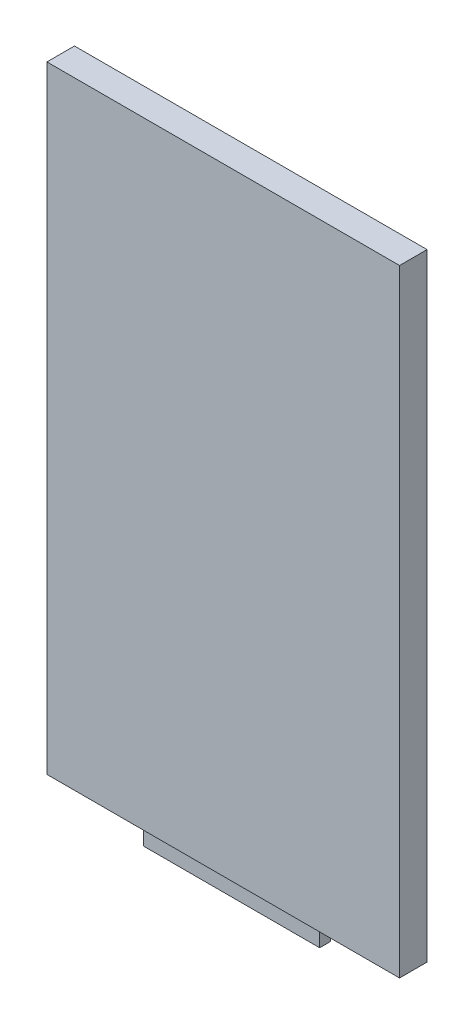
ISO-10303-21;
HEADER;
FILE_DESCRIPTION(('STEP AP214'),'2;1');
FILE_NAME('part.step','',(''),(''),'','','');
FILE_SCHEMA(('AUTOMOTIVE_DESIGN { 1 0 10303 214 1 1 1 1 }'));
ENDSEC;
DATA;
#1=APPLICATION_CONTEXT('core data for automotive mechanical design processes');
#2=APPLICATION_PROTOCOL_DEFINITION('international standard','automotive_design',2000,#1);
#3=PRODUCT_CONTEXT('',#1,'mechanical');
#4=PRODUCT('Part','Part','',(#3));
#5=PRODUCT_RELATED_PRODUCT_CATEGORY('part','',(#4));
#6=PRODUCT_DEFINITION_FORMATION('','',#4);
#7=PRODUCT_DEFINITION_CONTEXT('part definition',#1,'design');
#8=PRODUCT_DEFINITION('design','',#6,#7);
#9=PRODUCT_DEFINITION_SHAPE('','',#8);
#10=(LENGTH_UNIT() NAMED_UNIT(*) SI_UNIT(.MILLI.,.METRE.));
#11=(NAMED_UNIT(*) PLANE_ANGLE_UNIT() SI_UNIT($,.RADIAN.));
#12=(NAMED_UNIT(*) SI_UNIT($,.STERADIAN.) SOLID_ANGLE_UNIT());
#13=UNCERTAINTY_MEASURE_WITH_UNIT(LENGTH_MEASURE(1.E-05),#10,'distance_accuracy_value','');
#14=(GEOMETRIC_REPRESENTATION_CONTEXT(3) GLOBAL_UNCERTAINTY_ASSIGNED_CONTEXT((#13)) GLOBAL_UNIT_ASSIGNED_CONTEXT((#10,
#11,#12)) REPRESENTATION_CONTEXT('',''));
#15=CARTESIAN_POINT('',(0.,0.,0.));
#16=DIRECTION('',(0.,0.,1.));
#17=DIRECTION('',(1.,0.,0.));
#18=AXIS2_PLACEMENT_3D('',#15,#16,#17);
#19=CARTESIAN_POINT('',(0.,0.,0.));
#20=DIRECTION('',(0.,1.,0.));
#21=DIRECTION('',(0.,0.,1.));
#22=AXIS2_PLACEMENT_3D('',#19,#20,#21);
#23=PLANE('',#22);
#24=DIRECTION('',(0.,0.,1.));
#25=VECTOR('',#24,1.);
#26=CARTESIAN_POINT('',(-15.9999999999999,0.,1.25));
#27=LINE('',#26,#25);
#28=CARTESIAN_POINT('',(-15.9999999999999,0.,-1.25));
#29=VERTEX_POINT('',#28);
#30=CARTESIAN_POINT('',(-15.9999999999999,0.,1.25));
#31=VERTEX_POINT('',#30);
#32=EDGE_CURVE('E128',#29,#31,#27,.T.);
#33=ORIENTED_EDGE('',*,*,#32,.F.);
#34=DIRECTION('',(-1.,0.,0.));
#35=VECTOR('',#34,1.);
#36=CARTESIAN_POINT('',(16.0000000000001,0.,-1.25));
#37=LINE('',#36,#35);
#38=CARTESIAN_POINT('',(16.0000000000001,0.,-1.25));
#39=VERTEX_POINT('',#38);
#40=EDGE_CURVE('E144',#39,#29,#37,.T.);
#41=ORIENTED_EDGE('',*,*,#40,.F.);
#42=DIRECTION('',(0.,0.,-1.));
#43=VECTOR('',#42,1.);
#44=CARTESIAN_POINT('',(16.0000000000001,0.,1.25));
#45=LINE('',#44,#43);
#46=CARTESIAN_POINT('',(16.0000000000001,0.,1.25));
#47=VERTEX_POINT('',#46);
#48=EDGE_CURVE('E156',#47,#39,#45,.T.);
#49=ORIENTED_EDGE('',*,*,#48,.F.);
#50=DIRECTION('',(1.,0.,0.));
#51=VECTOR('',#50,1.);
#52=CARTESIAN_POINT('',(16.0000000000001,0.,1.25));
#53=LINE('',#52,#51);
#54=EDGE_CURVE('E133',#31,#47,#53,.T.);
#55=ORIENTED_EDGE('',*,*,#54,.F.);
#56=EDGE_LOOP('',(#33,#41,#49,#55));
#57=FACE_BOUND('',#56,.T.);
#58=DIRECTION('',(0.,0.,1.));
#59=VECTOR('',#58,1.);
#60=CARTESIAN_POINT('',(8.,0.,0.5));
#61=LINE('',#60,#59);
#62=CARTESIAN_POINT('',(8.,0.,-0.5));
#63=VERTEX_POINT('',#62);
#64=CARTESIAN_POINT('',(8.,0.,0.5));
#65=VERTEX_POINT('',#64);
#66=EDGE_CURVE('E55',#63,#65,#61,.T.);
#67=ORIENTED_EDGE('',*,*,#66,.F.);
#68=DIRECTION('',(1.,0.,0.));
#69=VECTOR('',#68,1.);
#70=CARTESIAN_POINT('',(-8.,0.,-0.5));
#71=LINE('',#70,#69);
#72=CARTESIAN_POINT('',(-8.,0.,-0.5));
#73=VERTEX_POINT('',#72);
#74=EDGE_CURVE('E59',#73,#63,#71,.T.);
#75=ORIENTED_EDGE('',*,*,#74,.F.);
#76=DIRECTION('',(0.,0.,-1.));
#77=VECTOR('',#76,1.);
#78=CARTESIAN_POINT('',(-8.,0.,0.5));
#79=LINE('',#78,#77);
#80=CARTESIAN_POINT('',(-8.,0.,0.5));
#81=VERTEX_POINT('',#80);
#82=EDGE_CURVE('E283',#81,#73,#79,.T.);
#83=ORIENTED_EDGE('',*,*,#82,.F.);
#84=DIRECTION('',(-1.,0.,0.));
#85=VECTOR('',#84,1.);
#86=CARTESIAN_POINT('',(-8.,0.,0.5));
#87=LINE('',#86,#85);
#88=EDGE_CURVE('E293',#65,#81,#87,.T.);
#89=ORIENTED_EDGE('',*,*,#88,.F.);
#90=EDGE_LOOP('',(#67,#75,#83,#89));
#91=FACE_BOUND('',#90,.T.);
#92=ADVANCED_FACE('F39',(#57,#91),#23,.F.);
#93=CARTESIAN_POINT('',(-15.9999999999999,56.,1.25));
#94=DIRECTION('',(1.,0.,0.));
#95=DIRECTION('',(0.,0.,-1.));
#96=AXIS2_PLACEMENT_3D('',#93,#94,#95);
#97=PLANE('',#96);
#98=ORIENTED_EDGE('',*,*,#32,.T.);
#99=DIRECTION('',(0.,-1.,0.));
#100=VECTOR('',#99,1.);
#101=CARTESIAN_POINT('',(-15.9999999999999,56.,1.25));
#102=LINE('',#101,#100);
#103=CARTESIAN_POINT('',(-15.9999999999999,56.,1.25));
#104=VERTEX_POINT('',#103);
#105=EDGE_CURVE('E11',#104,#31,#102,.T.);
#106=ORIENTED_EDGE('',*,*,#105,.F.);
#107=DIRECTION('',(0.,0.,1.));
#108=VECTOR('',#107,1.);
#109=CARTESIAN_POINT('',(-15.9999999999999,56.,1.25));
#110=LINE('',#109,#108);
#111=CARTESIAN_POINT('',(-15.9999999999999,56.,-1.25));
#112=VERTEX_POINT('',#111);
#113=EDGE_CURVE('E139',#112,#104,#110,.T.);
#114=ORIENTED_EDGE('',*,*,#113,.F.);
#115=DIRECTION('',(0.,-1.,0.));
#116=VECTOR('',#115,1.);
#117=CARTESIAN_POINT('',(-15.9999999999999,56.,-1.25));
#118=LINE('',#117,#116);
#119=EDGE_CURVE('E152',#112,#29,#118,.T.);
#120=ORIENTED_EDGE('',*,*,#119,.T.);
#121=EDGE_LOOP('',(#98,#106,#114,#120));
#122=FACE_BOUND('',#121,.T.);
#123=ADVANCED_FACE('F41',(#122),#97,.F.);
#124=CARTESIAN_POINT('',(16.0000000000001,56.,1.25));
#125=DIRECTION('',(0.,0.,-1.));
#126=DIRECTION('',(-1.,0.,0.));
#127=AXIS2_PLACEMENT_3D('',#124,#125,#126);
#128=PLANE('',#127);
#129=ORIENTED_EDGE('',*,*,#54,.T.);
#130=DIRECTION('',(0.,-1.,0.));
#131=VECTOR('',#130,1.);
#132=CARTESIAN_POINT('',(16.0000000000001,56.,1.25));
#133=LINE('',#132,#131);
#134=CARTESIAN_POINT('',(16.0000000000001,56.,1.25));
#135=VERTEX_POINT('',#134);
#136=EDGE_CURVE('E48',#135,#47,#133,.T.);
#137=ORIENTED_EDGE('',*,*,#136,.F.);
#138=DIRECTION('',(1.,0.,0.));
#139=VECTOR('',#138,1.);
#140=CARTESIAN_POINT('',(16.0000000000001,56.,1.25));
#141=LINE('',#140,#139);
#142=EDGE_CURVE('E143',#104,#135,#141,.T.);
#143=ORIENTED_EDGE('',*,*,#142,.F.);
#144=ORIENTED_EDGE('',*,*,#105,.T.);
#145=EDGE_LOOP('',(#129,#137,#143,#144));
#146=FACE_BOUND('',#145,.T.);
#147=ADVANCED_FACE('F188',(#146),#128,.F.);
#148=CARTESIAN_POINT('',(16.0000000000001,56.,1.25));
#149=DIRECTION('',(-1.,0.,0.));
#150=DIRECTION('',(0.,0.,1.));
#151=AXIS2_PLACEMENT_3D('',#148,#149,#150);
#152=PLANE('',#151);
#153=ORIENTED_EDGE('',*,*,#48,.T.);
#154=DIRECTION('',(0.,-1.,0.));
#155=VECTOR('',#154,1.);
#156=CARTESIAN_POINT('',(16.0000000000001,56.,-1.25));
#157=LINE('',#156,#155);
#158=CARTESIAN_POINT('',(16.0000000000001,56.,-1.25));
#159=VERTEX_POINT('',#158);
#160=EDGE_CURVE('E164',#159,#39,#157,.T.);
#161=ORIENTED_EDGE('',*,*,#160,.F.);
#162=DIRECTION('',(0.,0.,-1.));
#163=VECTOR('',#162,1.);
#164=CARTESIAN_POINT('',(16.0000000000001,56.,1.25));
#165=LINE('',#164,#163);
#166=EDGE_CURVE('E147',#135,#159,#165,.T.);
#167=ORIENTED_EDGE('',*,*,#166,.F.);
#168=ORIENTED_EDGE('',*,*,#136,.T.);
#169=EDGE_LOOP('',(#153,#161,#167,#168));
#170=FACE_BOUND('',#169,.T.);
#171=ADVANCED_FACE('F173',(#170),#152,.F.);
#172=CARTESIAN_POINT('',(16.0000000000001,56.,-1.25));
#173=DIRECTION('',(0.,0.,1.));
#174=DIRECTION('',(1.,0.,0.));
#175=AXIS2_PLACEMENT_3D('',#172,#173,#174);
#176=PLANE('',#175);
#177=ORIENTED_EDGE('',*,*,#40,.T.);
#178=ORIENTED_EDGE('',*,*,#119,.F.);
#179=DIRECTION('',(-1.,0.,0.));
#180=VECTOR('',#179,1.);
#181=CARTESIAN_POINT('',(16.0000000000001,56.,-1.25));
#182=LINE('',#181,#180);
#183=EDGE_CURVE('E150',#159,#112,#182,.T.);
#184=ORIENTED_EDGE('',*,*,#183,.F.);
#185=ORIENTED_EDGE('',*,*,#160,.T.);
#186=EDGE_LOOP('',(#177,#178,#184,#185));
#187=FACE_BOUND('',#186,.T.);
#188=ADVANCED_FACE('F181',(#187),#176,.F.);
#189=CARTESIAN_POINT('',(0.,56.,0.));
#190=DIRECTION('',(0.,1.,0.));
#191=DIRECTION('',(0.,0.,1.));
#192=AXIS2_PLACEMENT_3D('',#189,#190,#191);
#193=PLANE('',#192);
#194=ORIENTED_EDGE('',*,*,#113,.T.);
#195=ORIENTED_EDGE('',*,*,#142,.T.);
#196=ORIENTED_EDGE('',*,*,#166,.T.);
#197=ORIENTED_EDGE('',*,*,#183,.T.);
#198=EDGE_LOOP('',(#194,#195,#196,#197));
#199=FACE_BOUND('',#198,.T.);
#200=ADVANCED_FACE('F187',(#199),#193,.T.);
#201=CARTESIAN_POINT('',(8.,-2.,0.5));
#202=DIRECTION('',(-1.,0.,0.));
#203=DIRECTION('',(0.,0.,1.));
#204=AXIS2_PLACEMENT_3D('',#201,#202,#203);
#205=PLANE('',#204);
#206=ORIENTED_EDGE('',*,*,#66,.T.);
#207=DIRECTION('',(0.,1.,0.));
#208=VECTOR('',#207,1.);
#209=CARTESIAN_POINT('',(8.,-2.,0.5));
#210=LINE('',#209,#208);
#211=CARTESIAN_POINT('',(8.,-2.,0.5));
#212=VERTEX_POINT('',#211);
#213=EDGE_CURVE('E108',#212,#65,#210,.T.);
#214=ORIENTED_EDGE('',*,*,#213,.F.);
#215=DIRECTION('',(0.,0.,1.));
#216=VECTOR('',#215,1.);
#217=CARTESIAN_POINT('',(8.,-2.,0.5));
#218=LINE('',#217,#216);
#219=CARTESIAN_POINT('',(8.,-2.,-0.5));
#220=VERTEX_POINT('',#219);
#221=EDGE_CURVE('E115',#220,#212,#218,.T.);
#222=ORIENTED_EDGE('',*,*,#221,.F.);
#223=DIRECTION('',(0.,1.,0.));
#224=VECTOR('',#223,1.);
#225=CARTESIAN_POINT('',(8.,-2.,-0.5));
#226=LINE('',#225,#224);
#227=EDGE_CURVE('E280',#220,#63,#226,.T.);
#228=ORIENTED_EDGE('',*,*,#227,.T.);
#229=EDGE_LOOP('',(#206,#214,#222,#228));
#230=FACE_BOUND('',#229,.T.);
#231=ADVANCED_FACE('F126',(#230),#205,.F.);
#232=CARTESIAN_POINT('',(-8.,-2.,0.5));
#233=DIRECTION('',(0.,0.,-1.));
#234=DIRECTION('',(-1.,0.,0.));
#235=AXIS2_PLACEMENT_3D('',#232,#233,#234);
#236=PLANE('',#235);
#237=ORIENTED_EDGE('',*,*,#88,.T.);
#238=DIRECTION('',(0.,1.,0.));
#239=VECTOR('',#238,1.);
#240=CARTESIAN_POINT('',(-8.,-2.,0.5));
#241=LINE('',#240,#239);
#242=CARTESIAN_POINT('',(-8.,-2.,0.5));
#243=VERTEX_POINT('',#242);
#244=EDGE_CURVE('E110',#243,#81,#241,.T.);
#245=ORIENTED_EDGE('',*,*,#244,.F.);
#246=DIRECTION('',(-1.,0.,0.));
#247=VECTOR('',#246,1.);
#248=CARTESIAN_POINT('',(-8.,-2.,0.5));
#249=LINE('',#248,#247);
#250=EDGE_CURVE('E103',#212,#243,#249,.T.);
#251=ORIENTED_EDGE('',*,*,#250,.F.);
#252=ORIENTED_EDGE('',*,*,#213,.T.);
#253=EDGE_LOOP('',(#237,#245,#251,#252));
#254=FACE_BOUND('',#253,.T.);
#255=ADVANCED_FACE('F106',(#254),#236,.F.);
#256=CARTESIAN_POINT('',(-8.,-2.,0.5));
#257=DIRECTION('',(1.,0.,0.));
#258=DIRECTION('',(0.,0.,-1.));
#259=AXIS2_PLACEMENT_3D('',#256,#257,#258);
#260=PLANE('',#259);
#261=ORIENTED_EDGE('',*,*,#82,.T.);
#262=DIRECTION('',(0.,1.,0.));
#263=VECTOR('',#262,1.);
#264=CARTESIAN_POINT('',(-8.,-2.,-0.5));
#265=LINE('',#264,#263);
#266=CARTESIAN_POINT('',(-8.,-2.,-0.5));
#267=VERTEX_POINT('',#266);
#268=EDGE_CURVE('E135',#267,#73,#265,.T.);
#269=ORIENTED_EDGE('',*,*,#268,.F.);
#270=DIRECTION('',(0.,0.,-1.));
#271=VECTOR('',#270,1.);
#272=CARTESIAN_POINT('',(-8.,-2.,0.5));
#273=LINE('',#272,#271);
#274=EDGE_CURVE('E114',#243,#267,#273,.T.);
#275=ORIENTED_EDGE('',*,*,#274,.F.);
#276=ORIENTED_EDGE('',*,*,#244,.T.);
#277=EDGE_LOOP('',(#261,#269,#275,#276));
#278=FACE_BOUND('',#277,.T.);
#279=ADVANCED_FACE('F212',(#278),#260,.F.);
#280=CARTESIAN_POINT('',(-8.,-2.,-0.5));
#281=DIRECTION('',(0.,0.,1.));
#282=DIRECTION('',(1.,0.,0.));
#283=AXIS2_PLACEMENT_3D('',#280,#281,#282);
#284=PLANE('',#283);
#285=ORIENTED_EDGE('',*,*,#74,.T.);
#286=ORIENTED_EDGE('',*,*,#227,.F.);
#287=DIRECTION('',(1.,0.,0.));
#288=VECTOR('',#287,1.);
#289=CARTESIAN_POINT('',(-8.,-2.,-0.5));
#290=LINE('',#289,#288);
#291=EDGE_CURVE('E120',#267,#220,#290,.T.);
#292=ORIENTED_EDGE('',*,*,#291,.F.);
#293=ORIENTED_EDGE('',*,*,#268,.T.);
#294=EDGE_LOOP('',(#285,#286,#292,#293));
#295=FACE_BOUND('',#294,.T.);
#296=ADVANCED_FACE('F217',(#295),#284,.F.);
#297=CARTESIAN_POINT('',(0.,-2.,0.));
#298=DIRECTION('',(0.,-1.,0.));
#299=DIRECTION('',(0.,0.,-1.));
#300=AXIS2_PLACEMENT_3D('',#297,#298,#299);
#301=PLANE('',#300);
#302=ORIENTED_EDGE('',*,*,#221,.T.);
#303=ORIENTED_EDGE('',*,*,#250,.T.);
#304=ORIENTED_EDGE('',*,*,#274,.T.);
#305=ORIENTED_EDGE('',*,*,#291,.T.);
#306=EDGE_LOOP('',(#302,#303,#304,#305));
#307=FACE_BOUND('',#306,.T.);
#308=ADVANCED_FACE('F118',(#307),#301,.T.);
#309=CLOSED_SHELL('',(#92,#123,#147,#171,#188,#200,#231,#255,#279,#296,#308));
#310=MANIFOLD_SOLID_BREP('B2',#309);
#311=ADVANCED_BREP_SHAPE_REPRESENTATION('',(#18,#310),#14);
#312=SHAPE_DEFINITION_REPRESENTATION(#9,#311);
ENDSEC;
END-ISO-10303-21;
